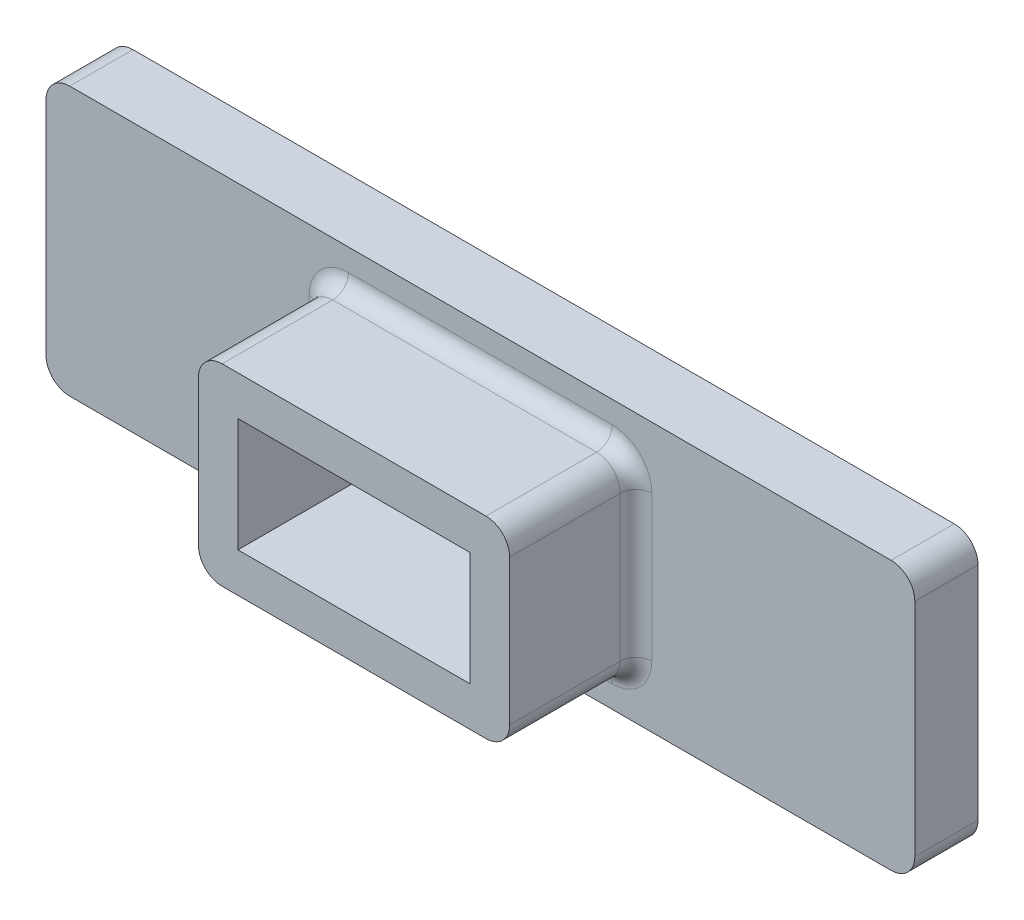
ISO-10303-21;
HEADER;
FILE_DESCRIPTION(('STEP AP214'),'2;1');
FILE_NAME('part.step','',(''),(''),'','','');
FILE_SCHEMA(('AUTOMOTIVE_DESIGN { 1 0 10303 214 1 1 1 1 }'));
ENDSEC;
DATA;
#1=APPLICATION_CONTEXT('core data for automotive mechanical design processes');
#2=APPLICATION_PROTOCOL_DEFINITION('international standard','automotive_design',2000,#1);
#3=PRODUCT_CONTEXT('',#1,'mechanical');
#4=PRODUCT('Part','Part','',(#3));
#5=PRODUCT_RELATED_PRODUCT_CATEGORY('part','',(#4));
#6=PRODUCT_DEFINITION_FORMATION('','',#4);
#7=PRODUCT_DEFINITION_CONTEXT('part definition',#1,'design');
#8=PRODUCT_DEFINITION('design','',#6,#7);
#9=PRODUCT_DEFINITION_SHAPE('','',#8);
#10=(LENGTH_UNIT() NAMED_UNIT(*) SI_UNIT(.MILLI.,.METRE.));
#11=(NAMED_UNIT(*) PLANE_ANGLE_UNIT() SI_UNIT($,.RADIAN.));
#12=(NAMED_UNIT(*) SI_UNIT($,.STERADIAN.) SOLID_ANGLE_UNIT());
#13=UNCERTAINTY_MEASURE_WITH_UNIT(LENGTH_MEASURE(1.E-05),#10,'distance_accuracy_value','');
#14=(GEOMETRIC_REPRESENTATION_CONTEXT(3) GLOBAL_UNCERTAINTY_ASSIGNED_CONTEXT((#13)) GLOBAL_UNIT_ASSIGNED_CONTEXT((#10,
#11,#12)) REPRESENTATION_CONTEXT('',''));
#15=CARTESIAN_POINT('',(0.,0.,0.));
#16=DIRECTION('',(0.,0.,1.));
#17=DIRECTION('',(1.,0.,0.));
#18=AXIS2_PLACEMENT_3D('',#15,#16,#17);
#19=CARTESIAN_POINT('',(0.,0.,5.08));
#20=DIRECTION('',(0.,0.,1.));
#21=DIRECTION('',(1.,0.,0.));
#22=AXIS2_PLACEMENT_3D('',#19,#20,#21);
#23=PLANE('',#22);
#24=DIRECTION('',(1.,0.,0.));
#25=VECTOR('',#24,1.);
#26=CARTESIAN_POINT('',(0.,-9.017,5.08));
#27=LINE('',#26,#25);
#28=CARTESIAN_POINT('',(10.6045,-9.017,5.08));
#29=VERTEX_POINT('',#28);
#30=CARTESIAN_POINT('',(-10.6045,-9.017,5.08));
#31=VERTEX_POINT('',#30);
#32=EDGE_CURVE('E401',#29,#31,#27,.F.);
#33=ORIENTED_EDGE('',*,*,#32,.T.);
#34=CARTESIAN_POINT('',(-10.6045,-5.842,5.08));
#35=DIRECTION('',(0.,0.,1.));
#36=DIRECTION('',(1.,0.,0.));
#37=AXIS2_PLACEMENT_3D('',#34,#35,#36);
#38=CIRCLE('',#37,3.175);
#39=CARTESIAN_POINT('',(-13.7795,-5.842,5.08));
#40=VERTEX_POINT('',#39);
#41=EDGE_CURVE('E422',#31,#40,#38,.F.);
#42=ORIENTED_EDGE('',*,*,#41,.T.);
#43=DIRECTION('',(0.,-1.,0.));
#44=VECTOR('',#43,1.);
#45=CARTESIAN_POINT('',(-13.7795,0.,5.08));
#46=LINE('',#45,#44);
#47=CARTESIAN_POINT('',(-13.7795,5.842,5.08));
#48=VERTEX_POINT('',#47);
#49=EDGE_CURVE('E419',#40,#48,#46,.F.);
#50=ORIENTED_EDGE('',*,*,#49,.T.);
#51=CARTESIAN_POINT('',(-10.6045,5.842,5.08));
#52=DIRECTION('',(0.,0.,1.));
#53=DIRECTION('',(1.,0.,0.));
#54=AXIS2_PLACEMENT_3D('',#51,#52,#53);
#55=CIRCLE('',#54,3.175);
#56=CARTESIAN_POINT('',(-10.6045,9.017,5.08));
#57=VERTEX_POINT('',#56);
#58=EDGE_CURVE('E416',#48,#57,#55,.F.);
#59=ORIENTED_EDGE('',*,*,#58,.T.);
#60=DIRECTION('',(-1.,0.,0.));
#61=VECTOR('',#60,1.);
#62=CARTESIAN_POINT('',(0.,9.017,5.08));
#63=LINE('',#62,#61);
#64=CARTESIAN_POINT('',(10.6045,9.017,5.08));
#65=VERTEX_POINT('',#64);
#66=EDGE_CURVE('E413',#57,#65,#63,.F.);
#67=ORIENTED_EDGE('',*,*,#66,.T.);
#68=CARTESIAN_POINT('',(10.6045,5.842,5.08));
#69=DIRECTION('',(0.,0.,1.));
#70=DIRECTION('',(1.,0.,0.));
#71=AXIS2_PLACEMENT_3D('',#68,#69,#70);
#72=CIRCLE('',#71,3.175);
#73=CARTESIAN_POINT('',(13.7795,5.842,5.08));
#74=VERTEX_POINT('',#73);
#75=EDGE_CURVE('E410',#65,#74,#72,.F.);
#76=ORIENTED_EDGE('',*,*,#75,.T.);
#77=DIRECTION('',(0.,1.,0.));
#78=VECTOR('',#77,1.);
#79=CARTESIAN_POINT('',(13.7795,0.,5.08));
#80=LINE('',#79,#78);
#81=CARTESIAN_POINT('',(13.7795,-5.842,5.08));
#82=VERTEX_POINT('',#81);
#83=EDGE_CURVE('E407',#74,#82,#80,.F.);
#84=ORIENTED_EDGE('',*,*,#83,.T.);
#85=CARTESIAN_POINT('',(10.6045,-5.842,5.08));
#86=DIRECTION('',(0.,0.,1.));
#87=DIRECTION('',(1.,0.,0.));
#88=AXIS2_PLACEMENT_3D('',#85,#86,#87);
#89=CIRCLE('',#88,3.175);
#90=EDGE_CURVE('E404',#82,#29,#89,.F.);
#91=ORIENTED_EDGE('',*,*,#90,.T.);
#92=EDGE_LOOP('',(#33,#42,#50,#59,#67,#76,#84,#91));
#93=FACE_BOUND('',#92,.T.);
#94=DIRECTION('',(0.,1.,0.));
#95=VECTOR('',#94,1.);
#96=CARTESIAN_POINT('',(34.925,10.795,5.08));
#97=LINE('',#96,#95);
#98=CARTESIAN_POINT('',(34.925,-8.89,5.08));
#99=VERTEX_POINT('',#98);
#100=CARTESIAN_POINT('',(34.925,8.89,5.08));
#101=VERTEX_POINT('',#100);
#102=EDGE_CURVE('E280',#99,#101,#97,.T.);
#103=ORIENTED_EDGE('',*,*,#102,.T.);
#104=CARTESIAN_POINT('',(33.02,8.89,5.08));
#105=DIRECTION('',(0.,0.,1.));
#106=DIRECTION('',(1.,0.,0.));
#107=AXIS2_PLACEMENT_3D('',#104,#105,#106);
#108=CIRCLE('',#107,1.905);
#109=CARTESIAN_POINT('',(33.02,10.795,5.08));
#110=VERTEX_POINT('',#109);
#111=EDGE_CURVE('E384',#101,#110,#108,.T.);
#112=ORIENTED_EDGE('',*,*,#111,.T.);
#113=DIRECTION('',(-1.,0.,0.));
#114=VECTOR('',#113,1.);
#115=CARTESIAN_POINT('',(-34.925,10.795,5.08));
#116=LINE('',#115,#114);
#117=CARTESIAN_POINT('',(-33.02,10.795,5.08));
#118=VERTEX_POINT('',#117);
#119=EDGE_CURVE('E284',#110,#118,#116,.T.);
#120=ORIENTED_EDGE('',*,*,#119,.T.);
#121=CARTESIAN_POINT('',(-33.02,8.89,5.08));
#122=DIRECTION('',(0.,0.,1.));
#123=DIRECTION('',(1.,0.,0.));
#124=AXIS2_PLACEMENT_3D('',#121,#122,#123);
#125=CIRCLE('',#124,1.905);
#126=CARTESIAN_POINT('',(-34.925,8.89,5.08));
#127=VERTEX_POINT('',#126);
#128=EDGE_CURVE('E378',#118,#127,#125,.T.);
#129=ORIENTED_EDGE('',*,*,#128,.T.);
#130=DIRECTION('',(0.,-1.,0.));
#131=VECTOR('',#130,1.);
#132=CARTESIAN_POINT('',(-34.925,10.795,5.08));
#133=LINE('',#132,#131);
#134=CARTESIAN_POINT('',(-34.925,-8.89,5.08));
#135=VERTEX_POINT('',#134);
#136=EDGE_CURVE('E289',#127,#135,#133,.T.);
#137=ORIENTED_EDGE('',*,*,#136,.T.);
#138=CARTESIAN_POINT('',(-33.02,-8.89,5.08));
#139=DIRECTION('',(0.,0.,1.));
#140=DIRECTION('',(1.,0.,0.));
#141=AXIS2_PLACEMENT_3D('',#138,#139,#140);
#142=CIRCLE('',#141,1.905);
#143=CARTESIAN_POINT('',(-33.02,-10.795,5.08));
#144=VERTEX_POINT('',#143);
#145=EDGE_CURVE('E375',#135,#144,#142,.T.);
#146=ORIENTED_EDGE('',*,*,#145,.T.);
#147=DIRECTION('',(1.,0.,0.));
#148=VECTOR('',#147,1.);
#149=CARTESIAN_POINT('',(-34.925,-10.795,5.08));
#150=LINE('',#149,#148);
#151=CARTESIAN_POINT('',(33.02,-10.795,5.08));
#152=VERTEX_POINT('',#151);
#153=EDGE_CURVE('E293',#144,#152,#150,.T.);
#154=ORIENTED_EDGE('',*,*,#153,.T.);
#155=CARTESIAN_POINT('',(33.02,-8.89,5.08));
#156=DIRECTION('',(0.,0.,1.));
#157=DIRECTION('',(1.,0.,0.));
#158=AXIS2_PLACEMENT_3D('',#155,#156,#157);
#159=CIRCLE('',#158,1.905);
#160=EDGE_CURVE('E381',#152,#99,#159,.T.);
#161=ORIENTED_EDGE('',*,*,#160,.T.);
#162=EDGE_LOOP('',(#103,#112,#120,#129,#137,#146,#154,#161));
#163=FACE_BOUND('',#162,.T.);
#164=ADVANCED_FACE('F46',(#93,#163),#23,.T.);
#165=CARTESIAN_POINT('',(34.925,10.795,5.08));
#166=DIRECTION('',(-1.,0.,0.));
#167=DIRECTION('',(0.,0.,1.));
#168=AXIS2_PLACEMENT_3D('',#165,#166,#167);
#169=PLANE('',#168);
#170=DIRECTION('',(0.,1.,0.));
#171=VECTOR('',#170,1.);
#172=CARTESIAN_POINT('',(34.925,10.795,0.));
#173=LINE('',#172,#171);
#174=CARTESIAN_POINT('',(34.925,-8.89,0.));
#175=VERTEX_POINT('',#174);
#176=CARTESIAN_POINT('',(34.925,8.89,0.));
#177=VERTEX_POINT('',#176);
#178=EDGE_CURVE('E279',#175,#177,#173,.T.);
#179=ORIENTED_EDGE('',*,*,#178,.T.);
#180=DIRECTION('',(0.,0.,-1.));
#181=VECTOR('',#180,1.);
#182=CARTESIAN_POINT('',(34.925,8.89,5.08));
#183=LINE('',#182,#181);
#184=EDGE_CURVE('E372',#177,#101,#183,.F.);
#185=ORIENTED_EDGE('',*,*,#184,.T.);
#186=ORIENTED_EDGE('',*,*,#102,.F.);
#187=DIRECTION('',(0.,0.,-1.));
#188=VECTOR('',#187,1.);
#189=CARTESIAN_POINT('',(34.925,-8.89,5.08));
#190=LINE('',#189,#188);
#191=EDGE_CURVE('E368',#99,#175,#190,.T.);
#192=ORIENTED_EDGE('',*,*,#191,.T.);
#193=EDGE_LOOP('',(#179,#185,#186,#192));
#194=FACE_BOUND('',#193,.T.);
#195=ADVANCED_FACE('F542',(#194),#169,.F.);
#196=CARTESIAN_POINT('',(-34.925,10.795,5.08));
#197=DIRECTION('',(0.,-1.,0.));
#198=DIRECTION('',(0.,0.,-1.));
#199=AXIS2_PLACEMENT_3D('',#196,#197,#198);
#200=PLANE('',#199);
#201=ORIENTED_EDGE('',*,*,#119,.F.);
#202=DIRECTION('',(0.,0.,-1.));
#203=VECTOR('',#202,1.);
#204=CARTESIAN_POINT('',(33.02,10.795,5.08));
#205=LINE('',#204,#203);
#206=CARTESIAN_POINT('',(33.02,10.795,0.));
#207=VERTEX_POINT('',#206);
#208=EDGE_CURVE('E352',#110,#207,#205,.T.);
#209=ORIENTED_EDGE('',*,*,#208,.T.);
#210=DIRECTION('',(-1.,0.,0.));
#211=VECTOR('',#210,1.);
#212=CARTESIAN_POINT('',(-34.925,10.795,0.));
#213=LINE('',#212,#211);
#214=CARTESIAN_POINT('',(-33.02,10.795,0.));
#215=VERTEX_POINT('',#214);
#216=EDGE_CURVE('E301',#207,#215,#213,.T.);
#217=ORIENTED_EDGE('',*,*,#216,.T.);
#218=DIRECTION('',(0.,0.,-1.));
#219=VECTOR('',#218,1.);
#220=CARTESIAN_POINT('',(-33.02,10.795,5.08));
#221=LINE('',#220,#219);
#222=EDGE_CURVE('E349',#215,#118,#221,.F.);
#223=ORIENTED_EDGE('',*,*,#222,.T.);
#224=EDGE_LOOP('',(#201,#209,#217,#223));
#225=FACE_BOUND('',#224,.T.);
#226=ADVANCED_FACE('F549',(#225),#200,.F.);
#227=CARTESIAN_POINT('',(-34.925,10.795,5.08));
#228=DIRECTION('',(1.,0.,0.));
#229=DIRECTION('',(0.,0.,-1.));
#230=AXIS2_PLACEMENT_3D('',#227,#228,#229);
#231=PLANE('',#230);
#232=ORIENTED_EDGE('',*,*,#136,.F.);
#233=DIRECTION('',(0.,0.,-1.));
#234=VECTOR('',#233,1.);
#235=CARTESIAN_POINT('',(-34.925,8.89,5.08));
#236=LINE('',#235,#234);
#237=CARTESIAN_POINT('',(-34.925,8.89,0.));
#238=VERTEX_POINT('',#237);
#239=EDGE_CURVE('E397',#127,#238,#236,.T.);
#240=ORIENTED_EDGE('',*,*,#239,.T.);
#241=DIRECTION('',(0.,-1.,0.));
#242=VECTOR('',#241,1.);
#243=CARTESIAN_POINT('',(-34.925,10.795,0.));
#244=LINE('',#243,#242);
#245=CARTESIAN_POINT('',(-34.925,-8.89,0.));
#246=VERTEX_POINT('',#245);
#247=EDGE_CURVE('E305',#238,#246,#244,.T.);
#248=ORIENTED_EDGE('',*,*,#247,.T.);
#249=DIRECTION('',(0.,0.,-1.));
#250=VECTOR('',#249,1.);
#251=CARTESIAN_POINT('',(-34.925,-8.89,5.08));
#252=LINE('',#251,#250);
#253=EDGE_CURVE('E394',#246,#135,#252,.F.);
#254=ORIENTED_EDGE('',*,*,#253,.T.);
#255=EDGE_LOOP('',(#232,#240,#248,#254));
#256=FACE_BOUND('',#255,.T.);
#257=ADVANCED_FACE('F787',(#256),#231,.F.);
#258=CARTESIAN_POINT('',(-34.925,-10.795,5.08));
#259=DIRECTION('',(0.,1.,0.));
#260=DIRECTION('',(0.,0.,1.));
#261=AXIS2_PLACEMENT_3D('',#258,#259,#260);
#262=PLANE('',#261);
#263=DIRECTION('',(1.,0.,0.));
#264=VECTOR('',#263,1.);
#265=CARTESIAN_POINT('',(-34.925,-10.795,0.));
#266=LINE('',#265,#264);
#267=CARTESIAN_POINT('',(-33.02,-10.795,0.));
#268=VERTEX_POINT('',#267);
#269=CARTESIAN_POINT('',(33.02,-10.795,0.));
#270=VERTEX_POINT('',#269);
#271=EDGE_CURVE('E285',#268,#270,#266,.T.);
#272=ORIENTED_EDGE('',*,*,#271,.T.);
#273=DIRECTION('',(0.,0.,-1.));
#274=VECTOR('',#273,1.);
#275=CARTESIAN_POINT('',(33.02,-10.795,5.08));
#276=LINE('',#275,#274);
#277=EDGE_CURVE('E391',#270,#152,#276,.F.);
#278=ORIENTED_EDGE('',*,*,#277,.T.);
#279=ORIENTED_EDGE('',*,*,#153,.F.);
#280=DIRECTION('',(0.,0.,-1.));
#281=VECTOR('',#280,1.);
#282=CARTESIAN_POINT('',(-33.02,-10.795,5.08));
#283=LINE('',#282,#281);
#284=EDGE_CURVE('E387',#144,#268,#283,.T.);
#285=ORIENTED_EDGE('',*,*,#284,.T.);
#286=EDGE_LOOP('',(#272,#278,#279,#285));
#287=FACE_BOUND('',#286,.T.);
#288=ADVANCED_FACE('F775',(#287),#262,.F.);
#289=CARTESIAN_POINT('',(0.,0.,0.));
#290=DIRECTION('',(0.,0.,1.));
#291=DIRECTION('',(1.,0.,0.));
#292=AXIS2_PLACEMENT_3D('',#289,#290,#291);
#293=PLANE('',#292);
#294=ORIENTED_EDGE('',*,*,#216,.F.);
#295=CARTESIAN_POINT('',(33.02,8.89,0.));
#296=DIRECTION('',(0.,0.,1.));
#297=DIRECTION('',(1.,0.,0.));
#298=AXIS2_PLACEMENT_3D('',#295,#296,#297);
#299=CIRCLE('',#298,1.905);
#300=EDGE_CURVE('E365',#207,#177,#299,.F.);
#301=ORIENTED_EDGE('',*,*,#300,.T.);
#302=ORIENTED_EDGE('',*,*,#178,.F.);
#303=CARTESIAN_POINT('',(33.02,-8.89,0.));
#304=DIRECTION('',(0.,0.,1.));
#305=DIRECTION('',(1.,0.,0.));
#306=AXIS2_PLACEMENT_3D('',#303,#304,#305);
#307=CIRCLE('',#306,1.905);
#308=EDGE_CURVE('E362',#175,#270,#307,.F.);
#309=ORIENTED_EDGE('',*,*,#308,.T.);
#310=ORIENTED_EDGE('',*,*,#271,.F.);
#311=CARTESIAN_POINT('',(-33.02,-8.89,0.));
#312=DIRECTION('',(0.,0.,1.));
#313=DIRECTION('',(1.,0.,0.));
#314=AXIS2_PLACEMENT_3D('',#311,#312,#313);
#315=CIRCLE('',#314,1.905);
#316=EDGE_CURVE('E356',#268,#246,#315,.F.);
#317=ORIENTED_EDGE('',*,*,#316,.T.);
#318=ORIENTED_EDGE('',*,*,#247,.F.);
#319=CARTESIAN_POINT('',(-33.02,8.89,0.));
#320=DIRECTION('',(0.,0.,1.));
#321=DIRECTION('',(1.,0.,0.));
#322=AXIS2_PLACEMENT_3D('',#319,#320,#321);
#323=CIRCLE('',#322,1.905);
#324=EDGE_CURVE('E359',#238,#215,#323,.F.);
#325=ORIENTED_EDGE('',*,*,#324,.T.);
#326=EDGE_LOOP('',(#294,#301,#302,#309,#310,#317,#318,#325));
#327=FACE_BOUND('',#326,.T.);
#328=ADVANCED_FACE('F539',(#327),#293,.F.);
#329=CARTESIAN_POINT('',(0.,0.,15.24));
#330=DIRECTION('',(0.,0.,1.));
#331=DIRECTION('',(1.,0.,0.));
#332=AXIS2_PLACEMENT_3D('',#329,#330,#331);
#333=PLANE('',#332);
#334=DIRECTION('',(-1.,0.,0.));
#335=VECTOR('',#334,1.);
#336=CARTESIAN_POINT('',(-12.5095,7.747,15.24));
#337=LINE('',#336,#335);
#338=CARTESIAN_POINT('',(10.6045,7.747,15.24));
#339=VERTEX_POINT('',#338);
#340=CARTESIAN_POINT('',(-10.6045,7.747,15.24));
#341=VERTEX_POINT('',#340);
#342=EDGE_CURVE('E267',#339,#341,#337,.T.);
#343=ORIENTED_EDGE('',*,*,#342,.T.);
#344=CARTESIAN_POINT('',(-10.6045,5.842,15.24));
#345=DIRECTION('',(0.,0.,1.));
#346=DIRECTION('',(1.,0.,0.));
#347=AXIS2_PLACEMENT_3D('',#344,#345,#346);
#348=CIRCLE('',#347,1.905);
#349=CARTESIAN_POINT('',(-12.5095,5.842,15.24));
#350=VERTEX_POINT('',#349);
#351=EDGE_CURVE('E334',#341,#350,#348,.T.);
#352=ORIENTED_EDGE('',*,*,#351,.T.);
#353=DIRECTION('',(0.,-1.,0.));
#354=VECTOR('',#353,1.);
#355=CARTESIAN_POINT('',(-12.5095,7.747,15.24));
#356=LINE('',#355,#354);
#357=CARTESIAN_POINT('',(-12.5095,-5.842,15.24));
#358=VERTEX_POINT('',#357);
#359=EDGE_CURVE('E271',#350,#358,#356,.T.);
#360=ORIENTED_EDGE('',*,*,#359,.T.);
#361=CARTESIAN_POINT('',(-10.6045,-5.842,15.24));
#362=DIRECTION('',(0.,0.,1.));
#363=DIRECTION('',(1.,0.,0.));
#364=AXIS2_PLACEMENT_3D('',#361,#362,#363);
#365=CIRCLE('',#364,1.905);
#366=CARTESIAN_POINT('',(-10.6045,-7.747,15.24));
#367=VERTEX_POINT('',#366);
#368=EDGE_CURVE('E325',#358,#367,#365,.T.);
#369=ORIENTED_EDGE('',*,*,#368,.T.);
#370=DIRECTION('',(1.,0.,0.));
#371=VECTOR('',#370,1.);
#372=CARTESIAN_POINT('',(-12.5095,-7.747,15.24));
#373=LINE('',#372,#371);
#374=CARTESIAN_POINT('',(10.6045,-7.747,15.24));
#375=VERTEX_POINT('',#374);
#376=EDGE_CURVE('E275',#367,#375,#373,.T.);
#377=ORIENTED_EDGE('',*,*,#376,.T.);
#378=CARTESIAN_POINT('',(10.6045,-5.842,15.24));
#379=DIRECTION('',(0.,0.,1.));
#380=DIRECTION('',(1.,0.,0.));
#381=AXIS2_PLACEMENT_3D('',#378,#379,#380);
#382=CIRCLE('',#381,1.905);
#383=CARTESIAN_POINT('',(12.5095,-5.842,15.24));
#384=VERTEX_POINT('',#383);
#385=EDGE_CURVE('E328',#375,#384,#382,.T.);
#386=ORIENTED_EDGE('',*,*,#385,.T.);
#387=DIRECTION('',(0.,1.,0.));
#388=VECTOR('',#387,1.);
#389=CARTESIAN_POINT('',(12.5095,7.747,15.24));
#390=LINE('',#389,#388);
#391=CARTESIAN_POINT('',(12.5095,5.842,15.24));
#392=VERTEX_POINT('',#391);
#393=EDGE_CURVE('E231',#384,#392,#390,.T.);
#394=ORIENTED_EDGE('',*,*,#393,.T.);
#395=CARTESIAN_POINT('',(10.6045,5.842,15.24));
#396=DIRECTION('',(0.,0.,1.));
#397=DIRECTION('',(1.,0.,0.));
#398=AXIS2_PLACEMENT_3D('',#395,#396,#397);
#399=CIRCLE('',#398,1.905);
#400=EDGE_CURVE('E331',#392,#339,#399,.T.);
#401=ORIENTED_EDGE('',*,*,#400,.T.);
#402=EDGE_LOOP('',(#343,#352,#360,#369,#377,#386,#394,#401));
#403=FACE_BOUND('',#402,.T.);
#404=DIRECTION('',(-1.,0.,0.));
#405=VECTOR('',#404,1.);
#406=CARTESIAN_POINT('',(-9.3345,4.572,15.24));
#407=LINE('',#406,#405);
#408=CARTESIAN_POINT('',(9.3345,4.572,15.24));
#409=VERTEX_POINT('',#408);
#410=CARTESIAN_POINT('',(-9.3345,4.572,15.24));
#411=VERTEX_POINT('',#410);
#412=EDGE_CURVE('E221',#409,#411,#407,.T.);
#413=ORIENTED_EDGE('',*,*,#412,.F.);
#414=DIRECTION('',(0.,1.,0.));
#415=VECTOR('',#414,1.);
#416=CARTESIAN_POINT('',(9.3345,4.572,15.24));
#417=LINE('',#416,#415);
#418=CARTESIAN_POINT('',(9.3345,-4.572,15.24));
#419=VERTEX_POINT('',#418);
#420=EDGE_CURVE('E210',#419,#409,#417,.T.);
#421=ORIENTED_EDGE('',*,*,#420,.F.);
#422=DIRECTION('',(1.,0.,0.));
#423=VECTOR('',#422,1.);
#424=CARTESIAN_POINT('',(-9.3345,-4.572,15.24));
#425=LINE('',#424,#423);
#426=CARTESIAN_POINT('',(-9.3345,-4.572,15.24));
#427=VERTEX_POINT('',#426);
#428=EDGE_CURVE('E241',#427,#419,#425,.T.);
#429=ORIENTED_EDGE('',*,*,#428,.F.);
#430=DIRECTION('',(0.,-1.,0.));
#431=VECTOR('',#430,1.);
#432=CARTESIAN_POINT('',(-9.3345,4.572,15.24));
#433=LINE('',#432,#431);
#434=EDGE_CURVE('E237',#411,#427,#433,.T.);
#435=ORIENTED_EDGE('',*,*,#434,.F.);
#436=EDGE_LOOP('',(#413,#421,#429,#435));
#437=FACE_BOUND('',#436,.T.);
#438=ADVANCED_FACE('F235',(#403,#437),#333,.T.);
#439=CARTESIAN_POINT('',(12.5095,7.747,15.24));
#440=DIRECTION('',(-1.,0.,0.));
#441=DIRECTION('',(0.,-1.,0.));
#442=AXIS2_PLACEMENT_3D('',#439,#440,#441);
#443=PLANE('',#442);
#444=DIRECTION('',(0.,0.,-1.));
#445=VECTOR('',#444,1.);
#446=CARTESIAN_POINT('',(12.5095,-5.842,15.24));
#447=LINE('',#446,#445);
#448=CARTESIAN_POINT('',(12.5095,-5.842,6.35));
#449=VERTEX_POINT('',#448);
#450=EDGE_CURVE('E337',#384,#449,#447,.T.);
#451=ORIENTED_EDGE('',*,*,#450,.T.);
#452=DIRECTION('',(0.,1.,0.));
#453=VECTOR('',#452,1.);
#454=CARTESIAN_POINT('',(12.5095,7.747,6.35));
#455=LINE('',#454,#453);
#456=CARTESIAN_POINT('',(12.5095,5.842,6.35));
#457=VERTEX_POINT('',#456);
#458=EDGE_CURVE('E442',#449,#457,#455,.T.);
#459=ORIENTED_EDGE('',*,*,#458,.T.);
#460=DIRECTION('',(0.,0.,-1.));
#461=VECTOR('',#460,1.);
#462=CARTESIAN_POINT('',(12.5095,5.842,15.24));
#463=LINE('',#462,#461);
#464=EDGE_CURVE('E340',#457,#392,#463,.F.);
#465=ORIENTED_EDGE('',*,*,#464,.T.);
#466=ORIENTED_EDGE('',*,*,#393,.F.);
#467=EDGE_LOOP('',(#451,#459,#465,#466));
#468=FACE_BOUND('',#467,.T.);
#469=ADVANCED_FACE('F530',(#468),#443,.F.);
#470=CARTESIAN_POINT('',(-12.5095,7.747,15.24));
#471=DIRECTION('',(0.,-1.,0.));
#472=DIRECTION('',(0.,0.,-1.));
#473=AXIS2_PLACEMENT_3D('',#470,#471,#472);
#474=PLANE('',#473);
#475=DIRECTION('',(0.,0.,-1.));
#476=VECTOR('',#475,1.);
#477=CARTESIAN_POINT('',(10.6045,7.747,15.24));
#478=LINE('',#477,#476);
#479=CARTESIAN_POINT('',(10.6045,7.747,6.35));
#480=VERTEX_POINT('',#479);
#481=EDGE_CURVE('E318',#339,#480,#478,.T.);
#482=ORIENTED_EDGE('',*,*,#481,.T.);
#483=DIRECTION('',(-1.,0.,0.));
#484=VECTOR('',#483,1.);
#485=CARTESIAN_POINT('',(-12.5095,7.747,6.35));
#486=LINE('',#485,#484);
#487=CARTESIAN_POINT('',(-10.6045,7.747,6.35));
#488=VERTEX_POINT('',#487);
#489=EDGE_CURVE('E436',#480,#488,#486,.T.);
#490=ORIENTED_EDGE('',*,*,#489,.T.);
#491=DIRECTION('',(0.,0.,-1.));
#492=VECTOR('',#491,1.);
#493=CARTESIAN_POINT('',(-10.6045,7.747,15.24));
#494=LINE('',#493,#492);
#495=EDGE_CURVE('E322',#488,#341,#494,.F.);
#496=ORIENTED_EDGE('',*,*,#495,.T.);
#497=ORIENTED_EDGE('',*,*,#342,.F.);
#498=EDGE_LOOP('',(#482,#490,#496,#497));
#499=FACE_BOUND('',#498,.T.);
#500=ADVANCED_FACE('F493',(#499),#474,.F.);
#501=CARTESIAN_POINT('',(-12.5095,7.747,15.24));
#502=DIRECTION('',(1.,0.,0.));
#503=DIRECTION('',(0.,0.,-1.));
#504=AXIS2_PLACEMENT_3D('',#501,#502,#503);
#505=PLANE('',#504);
#506=DIRECTION('',(0.,0.,-1.));
#507=VECTOR('',#506,1.);
#508=CARTESIAN_POINT('',(-12.5095,5.842,15.24));
#509=LINE('',#508,#507);
#510=CARTESIAN_POINT('',(-12.5095,5.842,6.35));
#511=VERTEX_POINT('',#510);
#512=EDGE_CURVE('E314',#350,#511,#509,.T.);
#513=ORIENTED_EDGE('',*,*,#512,.T.);
#514=DIRECTION('',(0.,-1.,0.));
#515=VECTOR('',#514,1.);
#516=CARTESIAN_POINT('',(-12.5095,7.747,6.35));
#517=LINE('',#516,#515);
#518=CARTESIAN_POINT('',(-12.5095,-5.842,6.35));
#519=VERTEX_POINT('',#518);
#520=EDGE_CURVE('E430',#511,#519,#517,.T.);
#521=ORIENTED_EDGE('',*,*,#520,.T.);
#522=DIRECTION('',(0.,0.,-1.));
#523=VECTOR('',#522,1.);
#524=CARTESIAN_POINT('',(-12.5095,-5.842,15.24));
#525=LINE('',#524,#523);
#526=EDGE_CURVE('E297',#519,#358,#525,.F.);
#527=ORIENTED_EDGE('',*,*,#526,.T.);
#528=ORIENTED_EDGE('',*,*,#359,.F.);
#529=EDGE_LOOP('',(#513,#521,#527,#528));
#530=FACE_BOUND('',#529,.T.);
#531=ADVANCED_FACE('F505',(#530),#505,.F.);
#532=CARTESIAN_POINT('',(-12.5095,-7.747,15.24));
#533=DIRECTION('',(0.,1.,0.));
#534=DIRECTION('',(0.,0.,1.));
#535=AXIS2_PLACEMENT_3D('',#532,#533,#534);
#536=PLANE('',#535);
#537=DIRECTION('',(0.,0.,-1.));
#538=VECTOR('',#537,1.);
#539=CARTESIAN_POINT('',(-10.6045,-7.747,15.24));
#540=LINE('',#539,#538);
#541=CARTESIAN_POINT('',(-10.6045,-7.747,6.35));
#542=VERTEX_POINT('',#541);
#543=EDGE_CURVE('E343',#367,#542,#540,.T.);
#544=ORIENTED_EDGE('',*,*,#543,.T.);
#545=DIRECTION('',(1.,0.,0.));
#546=VECTOR('',#545,1.);
#547=CARTESIAN_POINT('',(-12.5095,-7.747,6.35));
#548=LINE('',#547,#546);
#549=CARTESIAN_POINT('',(10.6045,-7.747,6.35));
#550=VERTEX_POINT('',#549);
#551=EDGE_CURVE('E11',#542,#550,#548,.T.);
#552=ORIENTED_EDGE('',*,*,#551,.T.);
#553=DIRECTION('',(0.,0.,-1.));
#554=VECTOR('',#553,1.);
#555=CARTESIAN_POINT('',(10.6045,-7.747,15.24));
#556=LINE('',#555,#554);
#557=EDGE_CURVE('E346',#550,#375,#556,.F.);
#558=ORIENTED_EDGE('',*,*,#557,.T.);
#559=ORIENTED_EDGE('',*,*,#376,.F.);
#560=EDGE_LOOP('',(#544,#552,#558,#559));
#561=FACE_BOUND('',#560,.T.);
#562=ADVANCED_FACE('F525',(#561),#536,.F.);
#563=CARTESIAN_POINT('',(9.3345,4.572,15.24));
#564=DIRECTION('',(-1.,0.,0.));
#565=DIRECTION('',(0.,0.,1.));
#566=AXIS2_PLACEMENT_3D('',#563,#564,#565);
#567=PLANE('',#566);
#568=DIRECTION('',(0.,1.,0.));
#569=VECTOR('',#568,1.);
#570=CARTESIAN_POINT('',(9.3345,4.572,5.08));
#571=LINE('',#570,#569);
#572=CARTESIAN_POINT('',(9.3345,-4.572,5.08));
#573=VERTEX_POINT('',#572);
#574=CARTESIAN_POINT('',(9.3345,4.572,5.08));
#575=VERTEX_POINT('',#574);
#576=EDGE_CURVE('E246',#573,#575,#571,.T.);
#577=ORIENTED_EDGE('',*,*,#576,.F.);
#578=DIRECTION('',(0.,0.,-1.));
#579=VECTOR('',#578,1.);
#580=CARTESIAN_POINT('',(9.3345,-4.572,15.24));
#581=LINE('',#580,#579);
#582=EDGE_CURVE('E216',#419,#573,#581,.T.);
#583=ORIENTED_EDGE('',*,*,#582,.F.);
#584=ORIENTED_EDGE('',*,*,#420,.T.);
#585=DIRECTION('',(0.,0.,-1.));
#586=VECTOR('',#585,1.);
#587=CARTESIAN_POINT('',(9.3345,4.572,15.24));
#588=LINE('',#587,#586);
#589=EDGE_CURVE('E214',#409,#575,#588,.T.);
#590=ORIENTED_EDGE('',*,*,#589,.T.);
#591=EDGE_LOOP('',(#577,#583,#584,#590));
#592=FACE_BOUND('',#591,.T.);
#593=ADVANCED_FACE('F213',(#592),#567,.T.);
#594=CARTESIAN_POINT('',(-9.3345,4.572,15.24));
#595=DIRECTION('',(0.,-1.,0.));
#596=DIRECTION('',(0.,0.,-1.));
#597=AXIS2_PLACEMENT_3D('',#594,#595,#596);
#598=PLANE('',#597);
#599=DIRECTION('',(-1.,0.,0.));
#600=VECTOR('',#599,1.);
#601=CARTESIAN_POINT('',(-9.3345,4.572,5.08));
#602=LINE('',#601,#600);
#603=CARTESIAN_POINT('',(-9.3345,4.572,5.08));
#604=VERTEX_POINT('',#603);
#605=EDGE_CURVE('E229',#575,#604,#602,.T.);
#606=ORIENTED_EDGE('',*,*,#605,.F.);
#607=ORIENTED_EDGE('',*,*,#589,.F.);
#608=ORIENTED_EDGE('',*,*,#412,.T.);
#609=DIRECTION('',(0.,0.,-1.));
#610=VECTOR('',#609,1.);
#611=CARTESIAN_POINT('',(-9.3345,4.572,15.24));
#612=LINE('',#611,#610);
#613=EDGE_CURVE('E232',#411,#604,#612,.T.);
#614=ORIENTED_EDGE('',*,*,#613,.T.);
#615=EDGE_LOOP('',(#606,#607,#608,#614));
#616=FACE_BOUND('',#615,.T.);
#617=ADVANCED_FACE('F226',(#616),#598,.T.);
#618=CARTESIAN_POINT('',(-9.3345,4.572,15.24));
#619=DIRECTION('',(1.,0.,0.));
#620=DIRECTION('',(0.,0.,-1.));
#621=AXIS2_PLACEMENT_3D('',#618,#619,#620);
#622=PLANE('',#621);
#623=DIRECTION('',(0.,-1.,0.));
#624=VECTOR('',#623,1.);
#625=CARTESIAN_POINT('',(-9.3345,4.572,5.08));
#626=LINE('',#625,#624);
#627=CARTESIAN_POINT('',(-9.3345,-4.572,5.08));
#628=VERTEX_POINT('',#627);
#629=EDGE_CURVE('E251',#604,#628,#626,.T.);
#630=ORIENTED_EDGE('',*,*,#629,.F.);
#631=ORIENTED_EDGE('',*,*,#613,.F.);
#632=ORIENTED_EDGE('',*,*,#434,.T.);
#633=DIRECTION('',(0.,0.,-1.));
#634=VECTOR('',#633,1.);
#635=CARTESIAN_POINT('',(-9.3345,-4.572,15.24));
#636=LINE('',#635,#634);
#637=EDGE_CURVE('E258',#427,#628,#636,.T.);
#638=ORIENTED_EDGE('',*,*,#637,.T.);
#639=EDGE_LOOP('',(#630,#631,#632,#638));
#640=FACE_BOUND('',#639,.T.);
#641=ADVANCED_FACE('F562',(#640),#622,.T.);
#642=CARTESIAN_POINT('',(-9.3345,-4.572,15.24));
#643=DIRECTION('',(0.,1.,0.));
#644=DIRECTION('',(0.,0.,1.));
#645=AXIS2_PLACEMENT_3D('',#642,#643,#644);
#646=PLANE('',#645);
#647=DIRECTION('',(1.,0.,0.));
#648=VECTOR('',#647,1.);
#649=CARTESIAN_POINT('',(-9.3345,-4.572,5.08));
#650=LINE('',#649,#648);
#651=EDGE_CURVE('E222',#628,#573,#650,.T.);
#652=ORIENTED_EDGE('',*,*,#651,.F.);
#653=ORIENTED_EDGE('',*,*,#637,.F.);
#654=ORIENTED_EDGE('',*,*,#428,.T.);
#655=ORIENTED_EDGE('',*,*,#582,.T.);
#656=EDGE_LOOP('',(#652,#653,#654,#655));
#657=FACE_BOUND('',#656,.T.);
#658=ADVANCED_FACE('F555',(#657),#646,.T.);
#659=ORIENTED_EDGE('',*,*,#576,.T.);
#660=ORIENTED_EDGE('',*,*,#605,.T.);
#661=ORIENTED_EDGE('',*,*,#629,.T.);
#662=ORIENTED_EDGE('',*,*,#651,.T.);
#663=EDGE_LOOP('',(#659,#660,#661,#662));
#664=FACE_BOUND('',#663,.T.);
#665=ADVANCED_FACE('F544',(#664),#23,.T.);
#666=CARTESIAN_POINT('',(-10.6045,5.842,15.24));
#667=DIRECTION('',(0.,0.,-1.));
#668=DIRECTION('',(-1.,0.,0.));
#669=AXIS2_PLACEMENT_3D('',#666,#667,#668);
#670=CYLINDRICAL_SURFACE('',#669,1.905);
#671=ORIENTED_EDGE('',*,*,#495,.F.);
#672=CARTESIAN_POINT('',(-10.6045,5.842,6.35));
#673=DIRECTION('',(0.,0.,1.));
#674=DIRECTION('',(1.,0.,0.));
#675=AXIS2_PLACEMENT_3D('',#672,#673,#674);
#676=CIRCLE('',#675,1.905);
#677=EDGE_CURVE('E433',#488,#511,#676,.T.);
#678=ORIENTED_EDGE('',*,*,#677,.T.);
#679=ORIENTED_EDGE('',*,*,#512,.F.);
#680=ORIENTED_EDGE('',*,*,#351,.F.);
#681=EDGE_LOOP('',(#671,#678,#679,#680));
#682=FACE_BOUND('',#681,.T.);
#683=ADVANCED_FACE('F500',(#682),#670,.T.);
#684=CARTESIAN_POINT('',(10.6045,5.842,15.24));
#685=DIRECTION('',(0.,0.,-1.));
#686=DIRECTION('',(-1.,0.,0.));
#687=AXIS2_PLACEMENT_3D('',#684,#685,#686);
#688=CYLINDRICAL_SURFACE('',#687,1.905);
#689=ORIENTED_EDGE('',*,*,#464,.F.);
#690=CARTESIAN_POINT('',(10.6045,5.842,6.35));
#691=DIRECTION('',(0.,0.,1.));
#692=DIRECTION('',(1.,0.,0.));
#693=AXIS2_PLACEMENT_3D('',#690,#691,#692);
#694=CIRCLE('',#693,1.905);
#695=EDGE_CURVE('E439',#457,#480,#694,.T.);
#696=ORIENTED_EDGE('',*,*,#695,.T.);
#697=ORIENTED_EDGE('',*,*,#481,.F.);
#698=ORIENTED_EDGE('',*,*,#400,.F.);
#699=EDGE_LOOP('',(#689,#696,#697,#698));
#700=FACE_BOUND('',#699,.T.);
#701=ADVANCED_FACE('F489',(#700),#688,.T.);
#702=CARTESIAN_POINT('',(10.6045,-5.842,15.24));
#703=DIRECTION('',(0.,0.,-1.));
#704=DIRECTION('',(-1.,0.,0.));
#705=AXIS2_PLACEMENT_3D('',#702,#703,#704);
#706=CYLINDRICAL_SURFACE('',#705,1.905);
#707=ORIENTED_EDGE('',*,*,#557,.F.);
#708=CARTESIAN_POINT('',(10.6045,-5.842,6.35));
#709=DIRECTION('',(0.,0.,1.));
#710=DIRECTION('',(1.,0.,0.));
#711=AXIS2_PLACEMENT_3D('',#708,#709,#710);
#712=CIRCLE('',#711,1.905);
#713=EDGE_CURVE('E56',#550,#449,#712,.T.);
#714=ORIENTED_EDGE('',*,*,#713,.T.);
#715=ORIENTED_EDGE('',*,*,#450,.F.);
#716=ORIENTED_EDGE('',*,*,#385,.F.);
#717=EDGE_LOOP('',(#707,#714,#715,#716));
#718=FACE_BOUND('',#717,.T.);
#719=ADVANCED_FACE('F528',(#718),#706,.T.);
#720=CARTESIAN_POINT('',(-10.6045,-5.842,15.24));
#721=DIRECTION('',(0.,0.,-1.));
#722=DIRECTION('',(-1.,0.,0.));
#723=AXIS2_PLACEMENT_3D('',#720,#721,#722);
#724=CYLINDRICAL_SURFACE('',#723,1.905);
#725=ORIENTED_EDGE('',*,*,#526,.F.);
#726=CARTESIAN_POINT('',(-10.6045,-5.842,6.35));
#727=DIRECTION('',(0.,0.,1.));
#728=DIRECTION('',(1.,0.,0.));
#729=AXIS2_PLACEMENT_3D('',#726,#727,#728);
#730=CIRCLE('',#729,1.905);
#731=EDGE_CURVE('E426',#519,#542,#730,.T.);
#732=ORIENTED_EDGE('',*,*,#731,.T.);
#733=ORIENTED_EDGE('',*,*,#543,.F.);
#734=ORIENTED_EDGE('',*,*,#368,.F.);
#735=EDGE_LOOP('',(#725,#732,#733,#734));
#736=FACE_BOUND('',#735,.T.);
#737=ADVANCED_FACE('F522',(#736),#724,.T.);
#738=CARTESIAN_POINT('',(33.02,8.89,5.08));
#739=DIRECTION('',(0.,0.,-1.));
#740=DIRECTION('',(-1.,0.,0.));
#741=AXIS2_PLACEMENT_3D('',#738,#739,#740);
#742=CYLINDRICAL_SURFACE('',#741,1.905);
#743=ORIENTED_EDGE('',*,*,#111,.F.);
#744=ORIENTED_EDGE('',*,*,#184,.F.);
#745=ORIENTED_EDGE('',*,*,#300,.F.);
#746=ORIENTED_EDGE('',*,*,#208,.F.);
#747=EDGE_LOOP('',(#743,#744,#745,#746));
#748=FACE_BOUND('',#747,.T.);
#749=ADVANCED_FACE('F617',(#748),#742,.T.);
#750=CARTESIAN_POINT('',(33.02,-8.89,5.08));
#751=DIRECTION('',(0.,0.,-1.));
#752=DIRECTION('',(-1.,0.,0.));
#753=AXIS2_PLACEMENT_3D('',#750,#751,#752);
#754=CYLINDRICAL_SURFACE('',#753,1.905);
#755=ORIENTED_EDGE('',*,*,#160,.F.);
#756=ORIENTED_EDGE('',*,*,#277,.F.);
#757=ORIENTED_EDGE('',*,*,#308,.F.);
#758=ORIENTED_EDGE('',*,*,#191,.F.);
#759=EDGE_LOOP('',(#755,#756,#757,#758));
#760=FACE_BOUND('',#759,.T.);
#761=ADVANCED_FACE('F711',(#760),#754,.T.);
#762=CARTESIAN_POINT('',(-33.02,8.89,5.08));
#763=DIRECTION('',(0.,0.,-1.));
#764=DIRECTION('',(-1.,0.,0.));
#765=AXIS2_PLACEMENT_3D('',#762,#763,#764);
#766=CYLINDRICAL_SURFACE('',#765,1.905);
#767=ORIENTED_EDGE('',*,*,#128,.F.);
#768=ORIENTED_EDGE('',*,*,#222,.F.);
#769=ORIENTED_EDGE('',*,*,#324,.F.);
#770=ORIENTED_EDGE('',*,*,#239,.F.);
#771=EDGE_LOOP('',(#767,#768,#769,#770));
#772=FACE_BOUND('',#771,.T.);
#773=ADVANCED_FACE('F702',(#772),#766,.T.);
#774=CARTESIAN_POINT('',(-33.02,-8.89,5.08));
#775=DIRECTION('',(0.,0.,-1.));
#776=DIRECTION('',(-1.,0.,0.));
#777=AXIS2_PLACEMENT_3D('',#774,#775,#776);
#778=CYLINDRICAL_SURFACE('',#777,1.905);
#779=ORIENTED_EDGE('',*,*,#145,.F.);
#780=ORIENTED_EDGE('',*,*,#253,.F.);
#781=ORIENTED_EDGE('',*,*,#316,.F.);
#782=ORIENTED_EDGE('',*,*,#284,.F.);
#783=EDGE_LOOP('',(#779,#780,#781,#782));
#784=FACE_BOUND('',#783,.T.);
#785=ADVANCED_FACE('F626',(#784),#778,.T.);
#786=CARTESIAN_POINT('',(10.6045,5.842,6.35));
#787=DIRECTION('',(0.,0.,1.));
#788=DIRECTION('',(1.,0.,0.));
#789=AXIS2_PLACEMENT_3D('',#786,#787,#788);
#790=TOROIDAL_SURFACE('',#789,3.175,1.27);
#791=CARTESIAN_POINT('',(10.6045,9.017,6.35));
#792=DIRECTION('',(1.,0.,0.));
#793=DIRECTION('',(0.,0.,-1.));
#794=AXIS2_PLACEMENT_3D('',#791,#792,#793);
#795=CIRCLE('',#794,1.27);
#796=EDGE_CURVE('E468',#480,#65,#795,.T.);
#797=ORIENTED_EDGE('',*,*,#796,.F.);
#798=ORIENTED_EDGE('',*,*,#695,.F.);
#799=CARTESIAN_POINT('',(13.7795,5.842,6.35));
#800=DIRECTION('',(0.,1.,0.));
#801=DIRECTION('',(0.,0.,1.));
#802=AXIS2_PLACEMENT_3D('',#799,#800,#801);
#803=CIRCLE('',#802,1.27);
#804=EDGE_CURVE('E50',#74,#457,#803,.T.);
#805=ORIENTED_EDGE('',*,*,#804,.F.);
#806=ORIENTED_EDGE('',*,*,#75,.F.);
#807=EDGE_LOOP('',(#797,#798,#805,#806));
#808=FACE_BOUND('',#807,.T.);
#809=ADVANCED_FACE('F48',(#808),#790,.F.);
#810=CARTESIAN_POINT('',(13.7795,7.747,6.35));
#811=DIRECTION('',(0.,1.,0.));
#812=DIRECTION('',(-1.,0.,0.));
#813=AXIS2_PLACEMENT_3D('',#810,#811,#812);
#814=CYLINDRICAL_SURFACE('',#813,1.27);
#815=ORIENTED_EDGE('',*,*,#804,.T.);
#816=ORIENTED_EDGE('',*,*,#458,.F.);
#817=CARTESIAN_POINT('',(13.7795,-5.842,6.35));
#818=DIRECTION('',(0.,1.,0.));
#819=DIRECTION('',(0.,0.,1.));
#820=AXIS2_PLACEMENT_3D('',#817,#818,#819);
#821=CIRCLE('',#820,1.27);
#822=EDGE_CURVE('E465',#82,#449,#821,.T.);
#823=ORIENTED_EDGE('',*,*,#822,.F.);
#824=ORIENTED_EDGE('',*,*,#83,.F.);
#825=EDGE_LOOP('',(#815,#816,#823,#824));
#826=FACE_BOUND('',#825,.T.);
#827=ADVANCED_FACE('F481',(#826),#814,.F.);
#828=CARTESIAN_POINT('',(-12.5095,9.017,6.35));
#829=DIRECTION('',(-1.,0.,0.));
#830=DIRECTION('',(0.,0.,1.));
#831=AXIS2_PLACEMENT_3D('',#828,#829,#830);
#832=CYLINDRICAL_SURFACE('',#831,1.27);
#833=ORIENTED_EDGE('',*,*,#796,.T.);
#834=ORIENTED_EDGE('',*,*,#66,.F.);
#835=CARTESIAN_POINT('',(-10.6045,9.017,6.35));
#836=DIRECTION('',(1.,0.,0.));
#837=DIRECTION('',(0.,0.,-1.));
#838=AXIS2_PLACEMENT_3D('',#835,#836,#837);
#839=CIRCLE('',#838,1.27);
#840=EDGE_CURVE('E461',#488,#57,#839,.T.);
#841=ORIENTED_EDGE('',*,*,#840,.F.);
#842=ORIENTED_EDGE('',*,*,#489,.F.);
#843=EDGE_LOOP('',(#833,#834,#841,#842));
#844=FACE_BOUND('',#843,.T.);
#845=ADVANCED_FACE('F634',(#844),#832,.F.);
#846=CARTESIAN_POINT('',(10.6045,-5.842,6.35));
#847=DIRECTION('',(0.,0.,1.));
#848=DIRECTION('',(1.,0.,0.));
#849=AXIS2_PLACEMENT_3D('',#846,#847,#848);
#850=TOROIDAL_SURFACE('',#849,3.175,1.27);
#851=ORIENTED_EDGE('',*,*,#822,.T.);
#852=ORIENTED_EDGE('',*,*,#713,.F.);
#853=CARTESIAN_POINT('',(10.6045,-9.017,6.35));
#854=DIRECTION('',(1.,0.,0.));
#855=DIRECTION('',(0.,0.,-1.));
#856=AXIS2_PLACEMENT_3D('',#853,#854,#855);
#857=CIRCLE('',#856,1.27);
#858=EDGE_CURVE('E457',#29,#550,#857,.T.);
#859=ORIENTED_EDGE('',*,*,#858,.F.);
#860=ORIENTED_EDGE('',*,*,#90,.F.);
#861=EDGE_LOOP('',(#851,#852,#859,#860));
#862=FACE_BOUND('',#861,.T.);
#863=ADVANCED_FACE('F641',(#862),#850,.F.);
#864=CARTESIAN_POINT('',(-10.6045,5.842,6.35));
#865=DIRECTION('',(0.,0.,1.));
#866=DIRECTION('',(1.,0.,0.));
#867=AXIS2_PLACEMENT_3D('',#864,#865,#866);
#868=TOROIDAL_SURFACE('',#867,3.175,1.27);
#869=ORIENTED_EDGE('',*,*,#840,.T.);
#870=ORIENTED_EDGE('',*,*,#58,.F.);
#871=CARTESIAN_POINT('',(-13.7795,5.842,6.35));
#872=DIRECTION('',(0.,1.,0.));
#873=DIRECTION('',(0.,0.,1.));
#874=AXIS2_PLACEMENT_3D('',#871,#872,#873);
#875=CIRCLE('',#874,1.27);
#876=EDGE_CURVE('E453',#511,#48,#875,.T.);
#877=ORIENTED_EDGE('',*,*,#876,.F.);
#878=ORIENTED_EDGE('',*,*,#677,.F.);
#879=EDGE_LOOP('',(#869,#870,#877,#878));
#880=FACE_BOUND('',#879,.T.);
#881=ADVANCED_FACE('F510',(#880),#868,.F.);
#882=CARTESIAN_POINT('',(-12.5095,-9.017,6.35));
#883=DIRECTION('',(1.,0.,0.));
#884=DIRECTION('',(0.,0.,-1.));
#885=AXIS2_PLACEMENT_3D('',#882,#883,#884);
#886=CYLINDRICAL_SURFACE('',#885,1.27);
#887=ORIENTED_EDGE('',*,*,#858,.T.);
#888=ORIENTED_EDGE('',*,*,#551,.F.);
#889=CARTESIAN_POINT('',(-10.6045,-9.017,6.35));
#890=DIRECTION('',(1.,0.,0.));
#891=DIRECTION('',(0.,0.,-1.));
#892=AXIS2_PLACEMENT_3D('',#889,#890,#891);
#893=CIRCLE('',#892,1.27);
#894=EDGE_CURVE('E450',#31,#542,#893,.T.);
#895=ORIENTED_EDGE('',*,*,#894,.F.);
#896=ORIENTED_EDGE('',*,*,#32,.F.);
#897=EDGE_LOOP('',(#887,#888,#895,#896));
#898=FACE_BOUND('',#897,.T.);
#899=ADVANCED_FACE('F657',(#898),#886,.F.);
#900=CARTESIAN_POINT('',(-13.7795,7.747,6.35));
#901=DIRECTION('',(0.,-1.,0.));
#902=DIRECTION('',(0.,0.,-1.));
#903=AXIS2_PLACEMENT_3D('',#900,#901,#902);
#904=CYLINDRICAL_SURFACE('',#903,1.27);
#905=ORIENTED_EDGE('',*,*,#876,.T.);
#906=ORIENTED_EDGE('',*,*,#49,.F.);
#907=CARTESIAN_POINT('',(-13.7795,-5.842,6.35));
#908=DIRECTION('',(0.,1.,0.));
#909=DIRECTION('',(0.,0.,1.));
#910=AXIS2_PLACEMENT_3D('',#907,#908,#909);
#911=CIRCLE('',#910,1.27);
#912=EDGE_CURVE('E447',#519,#40,#911,.T.);
#913=ORIENTED_EDGE('',*,*,#912,.F.);
#914=ORIENTED_EDGE('',*,*,#520,.F.);
#915=EDGE_LOOP('',(#905,#906,#913,#914));
#916=FACE_BOUND('',#915,.T.);
#917=ADVANCED_FACE('F514',(#916),#904,.F.);
#918=CARTESIAN_POINT('',(-10.6045,-5.842,6.35));
#919=DIRECTION('',(0.,0.,1.));
#920=DIRECTION('',(1.,0.,0.));
#921=AXIS2_PLACEMENT_3D('',#918,#919,#920);
#922=TOROIDAL_SURFACE('',#921,3.175,1.27);
#923=ORIENTED_EDGE('',*,*,#894,.T.);
#924=ORIENTED_EDGE('',*,*,#731,.F.);
#925=ORIENTED_EDGE('',*,*,#912,.T.);
#926=ORIENTED_EDGE('',*,*,#41,.F.);
#927=EDGE_LOOP('',(#923,#924,#925,#926));
#928=FACE_BOUND('',#927,.T.);
#929=ADVANCED_FACE('F518',(#928),#922,.F.);
#930=CLOSED_SHELL('',(#164,#195,#226,#257,#288,#328,#438,#469,#500,#531,#562,#593,#617,#641,
#658,#665,#683,#701,#719,#737,#749,#761,#773,#785,#809,#827,#845,#863,#881,#899,#917,#929));
#931=MANIFOLD_SOLID_BREP('B2',#930);
#932=ADVANCED_BREP_SHAPE_REPRESENTATION('',(#18,#931),#14);
#933=SHAPE_DEFINITION_REPRESENTATION(#9,#932);
ENDSEC;
END-ISO-10303-21;
